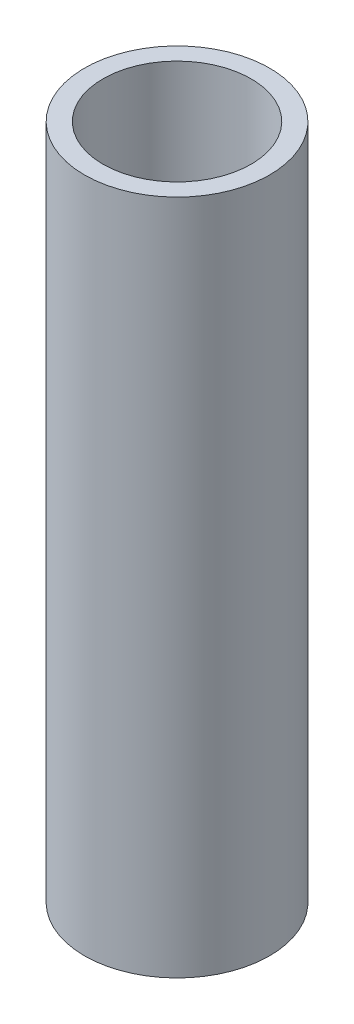
ISO-10303-21;
HEADER;
FILE_DESCRIPTION(('STEP AP214'),'2;1');
FILE_NAME('part.step','',(''),(''),'','','');
FILE_SCHEMA(('AUTOMOTIVE_DESIGN { 1 0 10303 214 1 1 1 1 }'));
ENDSEC;
DATA;
#1=APPLICATION_CONTEXT('core data for automotive mechanical design processes');
#2=APPLICATION_PROTOCOL_DEFINITION('international standard','automotive_design',2000,#1);
#3=PRODUCT_CONTEXT('',#1,'mechanical');
#4=PRODUCT('Part','Part','',(#3));
#5=PRODUCT_RELATED_PRODUCT_CATEGORY('part','',(#4));
#6=PRODUCT_DEFINITION_FORMATION('','',#4);
#7=PRODUCT_DEFINITION_CONTEXT('part definition',#1,'design');
#8=PRODUCT_DEFINITION('design','',#6,#7);
#9=PRODUCT_DEFINITION_SHAPE('','',#8);
#10=(LENGTH_UNIT() NAMED_UNIT(*) SI_UNIT(.MILLI.,.METRE.));
#11=(NAMED_UNIT(*) PLANE_ANGLE_UNIT() SI_UNIT($,.RADIAN.));
#12=(NAMED_UNIT(*) SI_UNIT($,.STERADIAN.) SOLID_ANGLE_UNIT());
#13=UNCERTAINTY_MEASURE_WITH_UNIT(LENGTH_MEASURE(1.E-05),#10,'distance_accuracy_value','');
#14=(GEOMETRIC_REPRESENTATION_CONTEXT(3) GLOBAL_UNCERTAINTY_ASSIGNED_CONTEXT((#13)) GLOBAL_UNIT_ASSIGNED_CONTEXT((#10,
#11,#12)) REPRESENTATION_CONTEXT('',''));
#15=CARTESIAN_POINT('',(0.,0.,0.));
#16=DIRECTION('',(0.,0.,1.));
#17=DIRECTION('',(1.,0.,0.));
#18=AXIS2_PLACEMENT_3D('',#15,#16,#17);
#19=CARTESIAN_POINT('',(0.,27.3950890038806,0.));
#20=DIRECTION('',(0.,1.,0.));
#21=DIRECTION('',(0.,0.,1.));
#22=AXIS2_PLACEMENT_3D('',#19,#20,#21);
#23=PLANE('',#22);
#24=CARTESIAN_POINT('',(0.,27.3950890038806,0.));
#25=DIRECTION('',(0.,1.,0.));
#26=DIRECTION('',(0.,0.,1.));
#27=AXIS2_PLACEMENT_3D('',#24,#25,#26);
#28=CIRCLE('',#27,3.75);
#29=CARTESIAN_POINT('',(0.,27.3950890038806,3.75));
#30=VERTEX_POINT('',#29);
#31=EDGE_CURVE('E10',#30,#30,#28,.T.);
#32=ORIENTED_EDGE('',*,*,#31,.T.);
#33=EDGE_LOOP('',(#32));
#34=FACE_BOUND('',#33,.T.);
#35=CARTESIAN_POINT('',(0.,27.3950890038806,0.));
#36=DIRECTION('',(0.,1.,0.));
#37=DIRECTION('',(0.,0.,1.));
#38=AXIS2_PLACEMENT_3D('',#35,#36,#37);
#39=CIRCLE('',#38,3.);
#40=CARTESIAN_POINT('',(0.,27.3950890038806,3.));
#41=VERTEX_POINT('',#40);
#42=EDGE_CURVE('E42',#41,#41,#39,.T.);
#43=ORIENTED_EDGE('',*,*,#42,.F.);
#44=EDGE_LOOP('',(#43));
#45=FACE_BOUND('',#44,.T.);
#46=ADVANCED_FACE('F31',(#34,#45),#23,.T.);
#47=CARTESIAN_POINT('',(0.,0.,0.));
#48=DIRECTION('',(0.,1.,0.));
#49=DIRECTION('',(0.,0.,1.));
#50=AXIS2_PLACEMENT_3D('',#47,#48,#49);
#51=PLANE('',#50);
#52=CARTESIAN_POINT('',(0.,0.,0.));
#53=DIRECTION('',(0.,1.,0.));
#54=DIRECTION('',(0.,0.,1.));
#55=AXIS2_PLACEMENT_3D('',#52,#53,#54);
#56=CIRCLE('',#55,3.75);
#57=CARTESIAN_POINT('',(0.,0.,3.75));
#58=VERTEX_POINT('',#57);
#59=EDGE_CURVE('E35',#58,#58,#56,.T.);
#60=ORIENTED_EDGE('',*,*,#59,.F.);
#61=EDGE_LOOP('',(#60));
#62=FACE_BOUND('',#61,.T.);
#63=CARTESIAN_POINT('',(0.,0.,0.));
#64=DIRECTION('',(0.,1.,0.));
#65=DIRECTION('',(0.,0.,1.));
#66=AXIS2_PLACEMENT_3D('',#63,#64,#65);
#67=CIRCLE('',#66,3.);
#68=CARTESIAN_POINT('',(0.,0.,3.));
#69=VERTEX_POINT('',#68);
#70=EDGE_CURVE('E44',#69,#69,#67,.T.);
#71=ORIENTED_EDGE('',*,*,#70,.T.);
#72=EDGE_LOOP('',(#71));
#73=FACE_BOUND('',#72,.T.);
#74=ADVANCED_FACE('F54',(#62,#73),#51,.F.);
#75=CARTESIAN_POINT('',(0.,27.3950890038806,0.));
#76=DIRECTION('',(0.,-1.,0.));
#77=DIRECTION('',(0.,0.,-1.));
#78=AXIS2_PLACEMENT_3D('',#75,#76,#77);
#79=CYLINDRICAL_SURFACE('',#78,3.75);
#80=ORIENTED_EDGE('',*,*,#31,.F.);
#81=EDGE_LOOP('',(#80));
#82=FACE_BOUND('',#81,.T.);
#83=ORIENTED_EDGE('',*,*,#59,.T.);
#84=EDGE_LOOP('',(#83));
#85=FACE_BOUND('',#84,.T.);
#86=ADVANCED_FACE('F33',(#82,#85),#79,.T.);
#87=CARTESIAN_POINT('',(0.,27.3950890038806,0.));
#88=DIRECTION('',(0.,-1.,0.));
#89=DIRECTION('',(0.,0.,-1.));
#90=AXIS2_PLACEMENT_3D('',#87,#88,#89);
#91=CYLINDRICAL_SURFACE('',#90,3.);
#92=ORIENTED_EDGE('',*,*,#42,.T.);
#93=EDGE_LOOP('',(#92));
#94=FACE_BOUND('',#93,.T.);
#95=ORIENTED_EDGE('',*,*,#70,.F.);
#96=EDGE_LOOP('',(#95));
#97=FACE_BOUND('',#96,.T.);
#98=ADVANCED_FACE('F50',(#94,#97),#91,.F.);
#99=CLOSED_SHELL('',(#46,#74,#86,#98));
#100=MANIFOLD_SOLID_BREP('B2',#99);
#101=ADVANCED_BREP_SHAPE_REPRESENTATION('',(#18,#100),#14);
#102=SHAPE_DEFINITION_REPRESENTATION(#9,#101);
ENDSEC;
END-ISO-10303-21;
